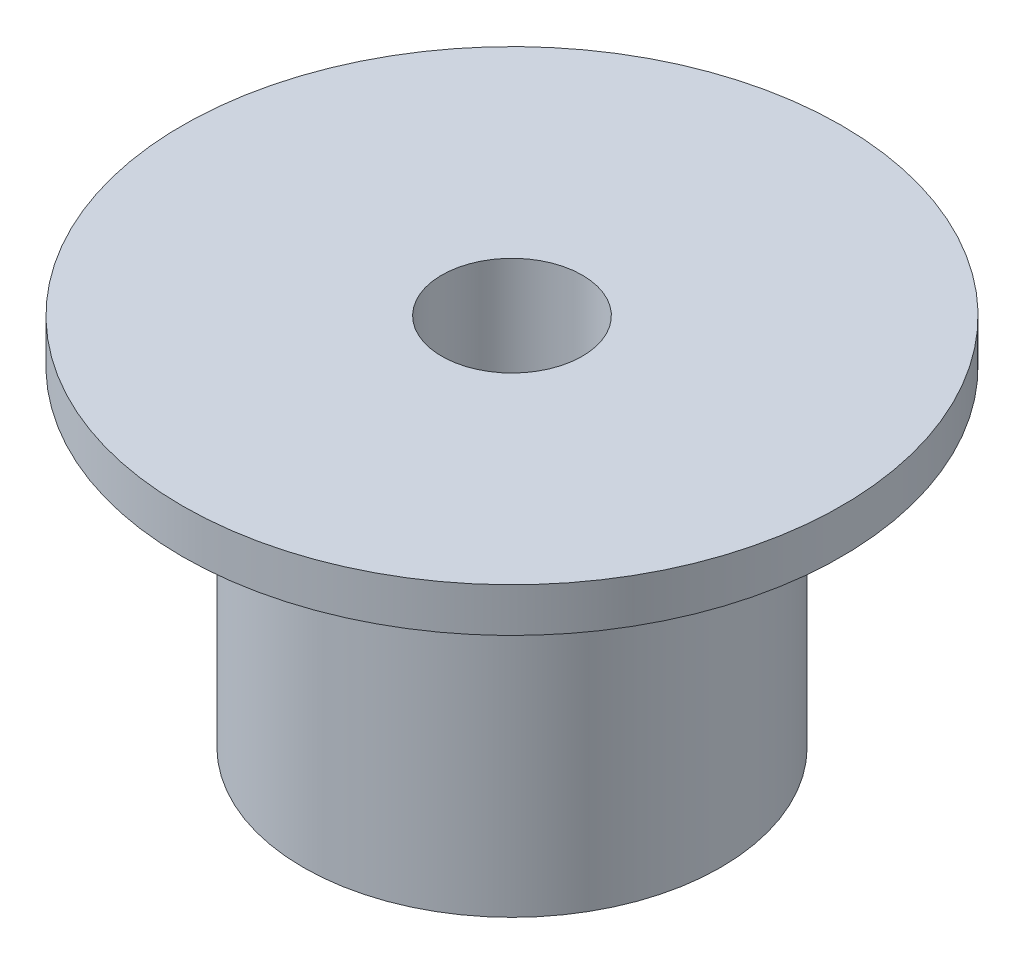
ISO-10303-21;
HEADER;
FILE_DESCRIPTION(('STEP AP214'),'2;1');
FILE_NAME('part.step','',(''),(''),'','','');
FILE_SCHEMA(('AUTOMOTIVE_DESIGN { 1 0 10303 214 1 1 1 1 }'));
ENDSEC;
DATA;
#1=APPLICATION_CONTEXT('core data for automotive mechanical design processes');
#2=APPLICATION_PROTOCOL_DEFINITION('international standard','automotive_design',2000,#1);
#3=PRODUCT_CONTEXT('',#1,'mechanical');
#4=PRODUCT('Part','Part','',(#3));
#5=PRODUCT_RELATED_PRODUCT_CATEGORY('part','',(#4));
#6=PRODUCT_DEFINITION_FORMATION('','',#4);
#7=PRODUCT_DEFINITION_CONTEXT('part definition',#1,'design');
#8=PRODUCT_DEFINITION('design','',#6,#7);
#9=PRODUCT_DEFINITION_SHAPE('','',#8);
#10=(LENGTH_UNIT() NAMED_UNIT(*) SI_UNIT(.MILLI.,.METRE.));
#11=(NAMED_UNIT(*) PLANE_ANGLE_UNIT() SI_UNIT($,.RADIAN.));
#12=(NAMED_UNIT(*) SI_UNIT($,.STERADIAN.) SOLID_ANGLE_UNIT());
#13=UNCERTAINTY_MEASURE_WITH_UNIT(LENGTH_MEASURE(1.E-05),#10,'distance_accuracy_value','');
#14=(GEOMETRIC_REPRESENTATION_CONTEXT(3) GLOBAL_UNCERTAINTY_ASSIGNED_CONTEXT((#13)) GLOBAL_UNIT_ASSIGNED_CONTEXT((#10,
#11,#12)) REPRESENTATION_CONTEXT('',''));
#15=CARTESIAN_POINT('',(0.,0.,0.));
#16=DIRECTION('',(0.,0.,1.));
#17=DIRECTION('',(1.,0.,0.));
#18=AXIS2_PLACEMENT_3D('',#15,#16,#17);
#19=CARTESIAN_POINT('',(0.,0.,0.));
#20=DIRECTION('',(0.,1.,0.));
#21=DIRECTION('',(0.,0.,1.));
#22=AXIS2_PLACEMENT_3D('',#19,#20,#21);
#23=PLANE('',#22);
#24=CARTESIAN_POINT('',(0.,0.,0.));
#25=DIRECTION('',(0.,1.,0.));
#26=DIRECTION('',(0.,0.,1.));
#27=AXIS2_PLACEMENT_3D('',#24,#25,#26);
#28=CIRCLE('',#27,4.826);
#29=CARTESIAN_POINT('',(0.,0.,-4.826));
#30=VERTEX_POINT('',#29);
#31=EDGE_CURVE('E38',#30,#30,#28,.T.);
#32=ORIENTED_EDGE('',*,*,#31,.F.);
#33=EDGE_LOOP('',(#32));
#34=FACE_BOUND('',#33,.T.);
#35=CARTESIAN_POINT('',(0.,0.,0.));
#36=DIRECTION('',(0.,1.,0.));
#37=DIRECTION('',(0.,0.,1.));
#38=AXIS2_PLACEMENT_3D('',#35,#36,#37);
#39=CIRCLE('',#38,1.6256);
#40=CARTESIAN_POINT('',(0.,0.,-1.6256));
#41=VERTEX_POINT('',#40);
#42=EDGE_CURVE('E45',#41,#41,#39,.T.);
#43=ORIENTED_EDGE('',*,*,#42,.T.);
#44=EDGE_LOOP('',(#43));
#45=FACE_BOUND('',#44,.T.);
#46=ADVANCED_FACE('F34',(#34,#45),#23,.F.);
#47=CARTESIAN_POINT('',(0.,7.62,0.));
#48=DIRECTION('',(0.,-1.,0.));
#49=DIRECTION('',(0.,0.,-1.));
#50=AXIS2_PLACEMENT_3D('',#47,#48,#49);
#51=CYLINDRICAL_SURFACE('',#50,4.826);
#52=CARTESIAN_POINT('',(0.,7.62,0.));
#53=DIRECTION('',(0.,1.,0.));
#54=DIRECTION('',(0.,0.,1.));
#55=AXIS2_PLACEMENT_3D('',#52,#53,#54);
#56=CIRCLE('',#55,4.826);
#57=CARTESIAN_POINT('',(0.,7.62,-4.826));
#58=VERTEX_POINT('',#57);
#59=EDGE_CURVE('E10',#58,#58,#56,.T.);
#60=CARTESIAN_POINT('',(0.,7.62,-4.826));
#61=CARTESIAN_POINT('',(0.,7.540625,-4.826));
#62=CARTESIAN_POINT('',(0.,7.46125,-4.826));
#63=CARTESIAN_POINT('',(0.,7.3025,-4.826));
#64=CARTESIAN_POINT('',(0.,7.223125,-4.826));
#65=CARTESIAN_POINT('',(0.,7.064375,-4.826));
#66=CARTESIAN_POINT('',(0.,6.985,-4.826));
#67=CARTESIAN_POINT('',(0.,6.82625,-4.826));
#68=CARTESIAN_POINT('',(0.,6.746875,-4.826));
#69=CARTESIAN_POINT('',(0.,6.588125,-4.826));
#70=CARTESIAN_POINT('',(0.,6.50875,-4.826));
#71=CARTESIAN_POINT('',(0.,6.35,-4.826));
#72=CARTESIAN_POINT('',(0.,6.270625,-4.826));
#73=CARTESIAN_POINT('',(0.,6.111875,-4.826));
#74=CARTESIAN_POINT('',(0.,6.0325,-4.826));
#75=CARTESIAN_POINT('',(0.,5.87375,-4.826));
#76=CARTESIAN_POINT('',(0.,5.794375,-4.826));
#77=CARTESIAN_POINT('',(0.,5.635625,-4.826));
#78=CARTESIAN_POINT('',(0.,5.55625,-4.826));
#79=CARTESIAN_POINT('',(0.,5.3975,-4.826));
#80=CARTESIAN_POINT('',(0.,5.318125,-4.826));
#81=CARTESIAN_POINT('',(0.,5.159375,-4.826));
#82=CARTESIAN_POINT('',(0.,5.08,-4.826));
#83=CARTESIAN_POINT('',(0.,4.92125,-4.826));
#84=CARTESIAN_POINT('',(0.,4.841875,-4.826));
#85=CARTESIAN_POINT('',(0.,4.683125,-4.826));
#86=CARTESIAN_POINT('',(0.,4.60375,-4.826));
#87=CARTESIAN_POINT('',(0.,4.445,-4.826));
#88=CARTESIAN_POINT('',(0.,4.365625,-4.826));
#89=CARTESIAN_POINT('',(0.,4.206875,-4.826));
#90=CARTESIAN_POINT('',(0.,4.1275,-4.826));
#91=CARTESIAN_POINT('',(0.,3.96875,-4.826));
#92=CARTESIAN_POINT('',(0.,3.889375,-4.826));
#93=CARTESIAN_POINT('',(0.,3.730625,-4.826));
#94=CARTESIAN_POINT('',(0.,3.65125,-4.826));
#95=CARTESIAN_POINT('',(0.,3.4925,-4.826));
#96=CARTESIAN_POINT('',(0.,3.413125,-4.826));
#97=CARTESIAN_POINT('',(0.,3.254375,-4.826));
#98=CARTESIAN_POINT('',(0.,3.175,-4.826));
#99=CARTESIAN_POINT('',(0.,3.01625,-4.826));
#100=CARTESIAN_POINT('',(0.,2.936875,-4.826));
#101=CARTESIAN_POINT('',(0.,2.778125,-4.826));
#102=CARTESIAN_POINT('',(0.,2.69875,-4.826));
#103=CARTESIAN_POINT('',(0.,2.54,-4.826));
#104=CARTESIAN_POINT('',(0.,2.460625,-4.826));
#105=CARTESIAN_POINT('',(0.,2.301875,-4.826));
#106=CARTESIAN_POINT('',(0.,2.2225,-4.826));
#107=CARTESIAN_POINT('',(0.,2.06375,-4.826));
#108=CARTESIAN_POINT('',(0.,1.984375,-4.826));
#109=CARTESIAN_POINT('',(0.,1.825625,-4.826));
#110=CARTESIAN_POINT('',(0.,1.74625,-4.826));
#111=CARTESIAN_POINT('',(0.,1.5875,-4.826));
#112=CARTESIAN_POINT('',(0.,1.508125,-4.826));
#113=CARTESIAN_POINT('',(0.,1.349375,-4.826));
#114=CARTESIAN_POINT('',(0.,1.27,-4.826));
#115=CARTESIAN_POINT('',(0.,1.11125,-4.826));
#116=CARTESIAN_POINT('',(0.,1.031875,-4.826));
#117=CARTESIAN_POINT('',(0.,0.873125,-4.826));
#118=CARTESIAN_POINT('',(0.,0.79375,-4.826));
#119=CARTESIAN_POINT('',(0.,0.635,-4.826));
#120=CARTESIAN_POINT('',(0.,0.555625,-4.826));
#121=CARTESIAN_POINT('',(0.,0.396875,-4.826));
#122=CARTESIAN_POINT('',(0.,0.3175,-4.826));
#123=CARTESIAN_POINT('',(0.,0.15875,-4.826));
#124=CARTESIAN_POINT('',(0.,0.0793749999999999,-4.826));
#125=CARTESIAN_POINT('',(0.,0.,-4.826));
#126=B_SPLINE_CURVE_WITH_KNOTS('',3,(#60,#61,#62,#63,#64,#65,#66,#67,#68,#69,#70,#71,#72,#73,
#74,#75,#76,#77,#78,#79,#80,#81,#82,#83,#84,#85,#86,#87,#88,#89,#90,#91,#92,#93,#94,#95,#96,#97,
#98,#99,#100,#101,#102,#103,#104,#105,#106,#107,#108,#109,#110,#111,#112,#113,#114,#115,#116,
#117,#118,#119,#120,#121,#122,#123,#124,#125),.UNSPECIFIED.,.F.,.F.,(4,2,2,2,2,2,2,2,2,2,2,2,2,
2,2,2,2,2,2,2,2,2,2,2,2,2,2,2,2,2,2,2,4),(0.,0.238125,0.47625,0.714375000000001,0.9525,1.190625,
1.42875,1.666875,1.905,2.143125,2.38125,2.619375,2.8575,3.095625,3.33375,3.571875,3.81,4.048125,
4.28625,4.524375,4.7625,5.000625,5.23875,5.476875,5.715,5.953125,6.19125,6.429375,6.6675,
6.905625,7.14375,7.381875,7.62),.UNSPECIFIED.);
#127=EDGE_CURVE('BSEAM36',#58,#30,#126,.T.);
#128=ORIENTED_EDGE('',*,*,#59,.F.);
#129=ORIENTED_EDGE('',*,*,#31,.T.);
#130=ORIENTED_EDGE('',*,*,#127,.T.);
#131=ORIENTED_EDGE('',*,*,#127,.F.);
#132=EDGE_LOOP('',(#128,#130,#129,#131));
#133=FACE_BOUND('',#132,.T.);
#134=ADVANCED_FACE('F36',(#133),#51,.T.);
#135=CARTESIAN_POINT('',(0.,7.62,0.));
#136=DIRECTION('',(0.,-1.,0.));
#137=DIRECTION('',(0.,0.,-1.));
#138=AXIS2_PLACEMENT_3D('',#135,#136,#137);
#139=CYLINDRICAL_SURFACE('',#138,1.6256);
#140=CARTESIAN_POINT('',(0.,8.636,0.));
#141=DIRECTION('',(0.,-1.,0.));
#142=DIRECTION('',(0.,0.,-1.));
#143=AXIS2_PLACEMENT_3D('',#140,#141,#142);
#144=CIRCLE('',#143,1.6256);
#145=CARTESIAN_POINT('',(0.,8.636,-1.6256));
#146=VERTEX_POINT('',#145);
#147=EDGE_CURVE('E53',#146,#146,#144,.T.);
#148=CARTESIAN_POINT('',(0.,0.,-1.6256));
#149=CARTESIAN_POINT('',(0.,0.0899583333333334,-1.6256));
#150=CARTESIAN_POINT('',(0.,0.179916666666667,-1.6256));
#151=CARTESIAN_POINT('',(0.,0.359833333333334,-1.6256));
#152=CARTESIAN_POINT('',(0.,0.449791666666667,-1.6256));
#153=CARTESIAN_POINT('',(0.,0.629708333333334,-1.6256));
#154=CARTESIAN_POINT('',(0.,0.719666666666667,-1.6256));
#155=CARTESIAN_POINT('',(0.,0.899583333333334,-1.6256));
#156=CARTESIAN_POINT('',(0.,0.989541666666667,-1.6256));
#157=CARTESIAN_POINT('',(0.,1.16945833333333,-1.6256));
#158=CARTESIAN_POINT('',(0.,1.25941666666667,-1.6256));
#159=CARTESIAN_POINT('',(0.,1.43933333333333,-1.6256));
#160=CARTESIAN_POINT('',(0.,1.52929166666667,-1.6256));
#161=CARTESIAN_POINT('',(0.,1.70920833333333,-1.6256));
#162=CARTESIAN_POINT('',(0.,1.79916666666667,-1.6256));
#163=CARTESIAN_POINT('',(0.,1.97908333333333,-1.6256));
#164=CARTESIAN_POINT('',(0.,2.06904166666667,-1.6256));
#165=CARTESIAN_POINT('',(0.,2.24895833333333,-1.6256));
#166=CARTESIAN_POINT('',(0.,2.33891666666667,-1.6256));
#167=CARTESIAN_POINT('',(0.,2.51883333333333,-1.6256));
#168=CARTESIAN_POINT('',(0.,2.60879166666667,-1.6256));
#169=CARTESIAN_POINT('',(0.,2.78870833333333,-1.6256));
#170=CARTESIAN_POINT('',(0.,2.87866666666667,-1.6256));
#171=CARTESIAN_POINT('',(0.,3.05858333333333,-1.6256));
#172=CARTESIAN_POINT('',(0.,3.14854166666667,-1.6256));
#173=CARTESIAN_POINT('',(0.,3.32845833333333,-1.6256));
#174=CARTESIAN_POINT('',(0.,3.41841666666667,-1.6256));
#175=CARTESIAN_POINT('',(0.,3.59833333333333,-1.6256));
#176=CARTESIAN_POINT('',(0.,3.68829166666667,-1.6256));
#177=CARTESIAN_POINT('',(0.,3.86820833333333,-1.6256));
#178=CARTESIAN_POINT('',(0.,3.95816666666667,-1.6256));
#179=CARTESIAN_POINT('',(0.,4.13808333333333,-1.6256));
#180=CARTESIAN_POINT('',(0.,4.22804166666667,-1.6256));
#181=CARTESIAN_POINT('',(0.,4.40795833333333,-1.6256));
#182=CARTESIAN_POINT('',(0.,4.49791666666667,-1.6256));
#183=CARTESIAN_POINT('',(0.,4.67783333333333,-1.6256));
#184=CARTESIAN_POINT('',(0.,4.76779166666667,-1.6256));
#185=CARTESIAN_POINT('',(0.,4.94770833333333,-1.6256));
#186=CARTESIAN_POINT('',(0.,5.03766666666667,-1.6256));
#187=CARTESIAN_POINT('',(0.,5.21758333333333,-1.6256));
#188=CARTESIAN_POINT('',(0.,5.30754166666667,-1.6256));
#189=CARTESIAN_POINT('',(0.,5.48745833333333,-1.6256));
#190=CARTESIAN_POINT('',(0.,5.57741666666667,-1.6256));
#191=CARTESIAN_POINT('',(0.,5.75733333333333,-1.6256));
#192=CARTESIAN_POINT('',(0.,5.84729166666667,-1.6256));
#193=CARTESIAN_POINT('',(0.,6.02720833333333,-1.6256));
#194=CARTESIAN_POINT('',(0.,6.11716666666667,-1.6256));
#195=CARTESIAN_POINT('',(0.,6.29708333333333,-1.6256));
#196=CARTESIAN_POINT('',(0.,6.38704166666667,-1.6256));
#197=CARTESIAN_POINT('',(0.,6.56695833333333,-1.6256));
#198=CARTESIAN_POINT('',(0.,6.65691666666667,-1.6256));
#199=CARTESIAN_POINT('',(0.,6.83683333333333,-1.6256));
#200=CARTESIAN_POINT('',(0.,6.92679166666667,-1.6256));
#201=CARTESIAN_POINT('',(0.,7.10670833333333,-1.6256));
#202=CARTESIAN_POINT('',(0.,7.19666666666667,-1.6256));
#203=CARTESIAN_POINT('',(0.,7.37658333333333,-1.6256));
#204=CARTESIAN_POINT('',(0.,7.46654166666667,-1.6256));
#205=CARTESIAN_POINT('',(0.,7.64645833333333,-1.6256));
#206=CARTESIAN_POINT('',(0.,7.73641666666667,-1.6256));
#207=CARTESIAN_POINT('',(0.,7.91633333333333,-1.6256));
#208=CARTESIAN_POINT('',(0.,8.00629166666667,-1.6256));
#209=CARTESIAN_POINT('',(0.,8.18620833333333,-1.6256));
#210=CARTESIAN_POINT('',(0.,8.27616666666667,-1.6256));
#211=CARTESIAN_POINT('',(0.,8.45608333333333,-1.6256));
#212=CARTESIAN_POINT('',(0.,8.54604166666667,-1.6256));
#213=CARTESIAN_POINT('',(0.,8.636,-1.6256));
#214=B_SPLINE_CURVE_WITH_KNOTS('',3,(#148,#149,#150,#151,#152,#153,#154,#155,#156,#157,#158,
#159,#160,#161,#162,#163,#164,#165,#166,#167,#168,#169,#170,#171,#172,#173,#174,#175,#176,#177,
#178,#179,#180,#181,#182,#183,#184,#185,#186,#187,#188,#189,#190,#191,#192,#193,#194,#195,#196,
#197,#198,#199,#200,#201,#202,#203,#204,#205,#206,#207,#208,#209,#210,#211,#212,#213),
.UNSPECIFIED.,.F.,.F.,(4,2,2,2,2,2,2,2,2,2,2,2,2,2,2,2,2,2,2,2,2,2,2,2,2,2,2,2,2,2,2,2,4),(0.,
0.269875,0.53975,0.809625,1.0795,1.349375,1.61925,1.889125,2.159,2.428875,2.69875,2.968625,
3.2385,3.508375,3.77825,4.048125,4.318,4.587875,4.85775,5.127625,5.3975,5.667375,5.93725,
6.207125,6.477,6.746875,7.01675,7.286625,7.5565,7.826375,8.09625,8.366125,8.636),.UNSPECIFIED.);
#215=EDGE_CURVE('BSEAM62',#41,#146,#214,.T.);
#216=ORIENTED_EDGE('',*,*,#42,.F.);
#217=ORIENTED_EDGE('',*,*,#147,.F.);
#218=ORIENTED_EDGE('',*,*,#215,.T.);
#219=ORIENTED_EDGE('',*,*,#215,.F.);
#220=EDGE_LOOP('',(#216,#218,#217,#219));
#221=FACE_BOUND('',#220,.T.);
#222=ADVANCED_FACE('F62',(#221),#139,.F.);
#223=CARTESIAN_POINT('',(0.,8.636,0.));
#224=DIRECTION('',(0.,-1.,0.));
#225=DIRECTION('',(0.,0.,-1.));
#226=AXIS2_PLACEMENT_3D('',#223,#224,#225);
#227=CYLINDRICAL_SURFACE('',#226,7.62);
#228=CARTESIAN_POINT('',(0.,8.636,0.));
#229=DIRECTION('',(0.,1.,0.));
#230=DIRECTION('',(0.,0.,1.));
#231=AXIS2_PLACEMENT_3D('',#228,#229,#230);
#232=CIRCLE('',#231,7.62);
#233=CARTESIAN_POINT('',(0.,8.636,7.62));
#234=VERTEX_POINT('',#233);
#235=EDGE_CURVE('E49',#234,#234,#232,.T.);
#236=ORIENTED_EDGE('',*,*,#235,.F.);
#237=EDGE_LOOP('',(#236));
#238=FACE_BOUND('',#237,.T.);
#239=CARTESIAN_POINT('',(0.,7.62,0.));
#240=DIRECTION('',(0.,1.,0.));
#241=DIRECTION('',(0.,0.,1.));
#242=AXIS2_PLACEMENT_3D('',#239,#240,#241);
#243=CIRCLE('',#242,7.62);
#244=CARTESIAN_POINT('',(0.,7.62,7.62));
#245=VERTEX_POINT('',#244);
#246=EDGE_CURVE('E50',#245,#245,#243,.T.);
#247=ORIENTED_EDGE('',*,*,#246,.T.);
#248=EDGE_LOOP('',(#247));
#249=FACE_BOUND('',#248,.T.);
#250=ADVANCED_FACE('F64',(#238,#249),#227,.T.);
#251=CARTESIAN_POINT('',(0.,8.636,0.));
#252=DIRECTION('',(0.,1.,0.));
#253=DIRECTION('',(0.,0.,1.));
#254=AXIS2_PLACEMENT_3D('',#251,#252,#253);
#255=PLANE('',#254);
#256=ORIENTED_EDGE('',*,*,#147,.T.);
#257=EDGE_LOOP('',(#256));
#258=FACE_BOUND('',#257,.T.);
#259=ORIENTED_EDGE('',*,*,#235,.T.);
#260=EDGE_LOOP('',(#259));
#261=FACE_BOUND('',#260,.T.);
#262=ADVANCED_FACE('F59',(#258,#261),#255,.T.);
#263=CARTESIAN_POINT('',(0.,7.62,0.));
#264=DIRECTION('',(0.,1.,0.));
#265=DIRECTION('',(0.,0.,1.));
#266=AXIS2_PLACEMENT_3D('',#263,#264,#265);
#267=PLANE('',#266);
#268=ORIENTED_EDGE('',*,*,#59,.T.);
#269=EDGE_LOOP('',(#268));
#270=FACE_BOUND('',#269,.T.);
#271=ORIENTED_EDGE('',*,*,#246,.F.);
#272=EDGE_LOOP('',(#271));
#273=FACE_BOUND('',#272,.T.);
#274=ADVANCED_FACE('F100',(#270,#273),#267,.F.);
#275=CLOSED_SHELL('',(#46,#134,#222,#250,#262,#274));
#276=MANIFOLD_SOLID_BREP('B2',#275);
#277=ADVANCED_BREP_SHAPE_REPRESENTATION('',(#18,#276),#14);
#278=SHAPE_DEFINITION_REPRESENTATION(#9,#277);
ENDSEC;
END-ISO-10303-21;
